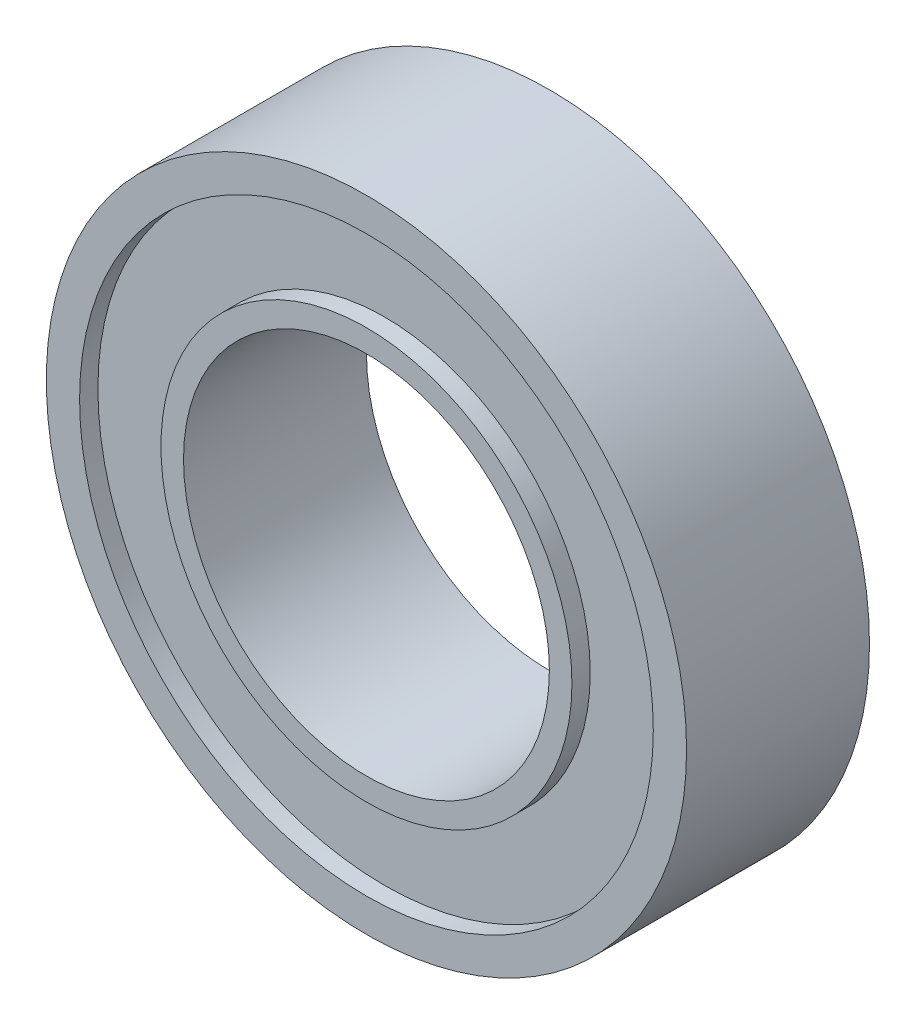
ISO-10303-21;
HEADER;
FILE_DESCRIPTION(('STEP AP214'),'2;1');
FILE_NAME('part.step','',(''),(''),'','','');
FILE_SCHEMA(('AUTOMOTIVE_DESIGN { 1 0 10303 214 1 1 1 1 }'));
ENDSEC;
DATA;
#1=APPLICATION_CONTEXT('core data for automotive mechanical design processes');
#2=APPLICATION_PROTOCOL_DEFINITION('international standard','automotive_design',2000,#1);
#3=PRODUCT_CONTEXT('',#1,'mechanical');
#4=PRODUCT('Part','Part','',(#3));
#5=PRODUCT_RELATED_PRODUCT_CATEGORY('part','',(#4));
#6=PRODUCT_DEFINITION_FORMATION('','',#4);
#7=PRODUCT_DEFINITION_CONTEXT('part definition',#1,'design');
#8=PRODUCT_DEFINITION('design','',#6,#7);
#9=PRODUCT_DEFINITION_SHAPE('','',#8);
#10=(LENGTH_UNIT() NAMED_UNIT(*) SI_UNIT(.MILLI.,.METRE.));
#11=(NAMED_UNIT(*) PLANE_ANGLE_UNIT() SI_UNIT($,.RADIAN.));
#12=(NAMED_UNIT(*) SI_UNIT($,.STERADIAN.) SOLID_ANGLE_UNIT());
#13=UNCERTAINTY_MEASURE_WITH_UNIT(LENGTH_MEASURE(1.E-05),#10,'distance_accuracy_value','');
#14=(GEOMETRIC_REPRESENTATION_CONTEXT(3) GLOBAL_UNCERTAINTY_ASSIGNED_CONTEXT((#13)) GLOBAL_UNIT_ASSIGNED_CONTEXT((#10,
#11,#12)) REPRESENTATION_CONTEXT('',''));
#15=CARTESIAN_POINT('',(0.,0.,0.));
#16=DIRECTION('',(0.,0.,1.));
#17=DIRECTION('',(1.,0.,0.));
#18=AXIS2_PLACEMENT_3D('',#15,#16,#17);
#19=CARTESIAN_POINT('',(0.,0.,0.3));
#20=DIRECTION('',(0.,0.,1.));
#21=DIRECTION('',(1.,0.,0.));
#22=AXIS2_PLACEMENT_3D('',#19,#20,#21);
#23=PLANE('',#22);
#24=CARTESIAN_POINT('',(0.,0.,0.3));
#25=DIRECTION('',(0.,0.,-1.));
#26=DIRECTION('',(1.,0.,0.));
#27=AXIS2_PLACEMENT_3D('',#24,#25,#26);
#28=CIRCLE('',#27,3.36995255977754);
#29=CARTESIAN_POINT('',(3.36995255977754,0.,0.3));
#30=VERTEX_POINT('',#29);
#31=EDGE_CURVE('E11',#30,#30,#28,.T.);
#32=ORIENTED_EDGE('',*,*,#31,.F.);
#33=EDGE_LOOP('',(#32));
#34=FACE_BOUND('',#33,.T.);
#35=CARTESIAN_POINT('',(0.,0.,0.3));
#36=DIRECTION('',(0.,0.,-1.));
#37=DIRECTION('',(1.,0.,0.));
#38=AXIS2_PLACEMENT_3D('',#35,#36,#37);
#39=CIRCLE('',#38,4.70453720566641);
#40=CARTESIAN_POINT('',(4.70453720566641,0.,0.3));
#41=VERTEX_POINT('',#40);
#42=EDGE_CURVE('E28',#41,#41,#39,.T.);
#43=ORIENTED_EDGE('',*,*,#42,.T.);
#44=EDGE_LOOP('',(#43));
#45=FACE_BOUND('',#44,.T.);
#46=ADVANCED_FACE('F17',(#34,#45),#23,.F.);
#47=CARTESIAN_POINT('',(0.,0.,0.3));
#48=DIRECTION('',(0.,0.,-1.));
#49=DIRECTION('',(-1.,0.,0.));
#50=AXIS2_PLACEMENT_3D('',#47,#48,#49);
#51=CYLINDRICAL_SURFACE('',#50,3.36995255977754);
#52=CARTESIAN_POINT('',(0.,0.,0.));
#53=DIRECTION('',(0.,0.,1.));
#54=DIRECTION('',(1.,0.,0.));
#55=AXIS2_PLACEMENT_3D('',#52,#53,#54);
#56=CIRCLE('',#55,3.36995255977754);
#57=CARTESIAN_POINT('',(3.36995255977754,0.,0.));
#58=VERTEX_POINT('',#57);
#59=EDGE_CURVE('E21',#58,#58,#56,.T.);
#60=ORIENTED_EDGE('',*,*,#59,.T.);
#61=EDGE_LOOP('',(#60));
#62=FACE_BOUND('',#61,.T.);
#63=ORIENTED_EDGE('',*,*,#31,.T.);
#64=EDGE_LOOP('',(#63));
#65=FACE_BOUND('',#64,.T.);
#66=ADVANCED_FACE('F137',(#62,#65),#51,.T.);
#67=CARTESIAN_POINT('',(0.,0.,0.3));
#68=DIRECTION('',(0.,0.,-1.));
#69=DIRECTION('',(-1.,0.,0.));
#70=AXIS2_PLACEMENT_3D('',#67,#68,#69);
#71=CYLINDRICAL_SURFACE('',#70,4.70453720566641);
#72=CARTESIAN_POINT('',(0.,0.,0.));
#73=DIRECTION('',(0.,0.,1.));
#74=DIRECTION('',(1.,0.,0.));
#75=AXIS2_PLACEMENT_3D('',#72,#73,#74);
#76=CIRCLE('',#75,4.70453720566641);
#77=CARTESIAN_POINT('',(4.70453720566641,0.,0.));
#78=VERTEX_POINT('',#77);
#79=EDGE_CURVE('E88',#78,#78,#76,.T.);
#80=ORIENTED_EDGE('',*,*,#79,.F.);
#81=EDGE_LOOP('',(#80));
#82=FACE_BOUND('',#81,.T.);
#83=ORIENTED_EDGE('',*,*,#42,.F.);
#84=EDGE_LOOP('',(#83));
#85=FACE_BOUND('',#84,.T.);
#86=ADVANCED_FACE('F19',(#82,#85),#71,.F.);
#87=CARTESIAN_POINT('',(0.,0.,2.7));
#88=DIRECTION('',(0.,0.,1.));
#89=DIRECTION('',(1.,0.,0.));
#90=AXIS2_PLACEMENT_3D('',#87,#88,#89);
#91=PLANE('',#90);
#92=CARTESIAN_POINT('',(0.,0.,2.7));
#93=DIRECTION('',(0.,0.,-1.));
#94=DIRECTION('',(1.,0.,0.));
#95=AXIS2_PLACEMENT_3D('',#92,#93,#94);
#96=CIRCLE('',#95,3.36995255977754);
#97=CARTESIAN_POINT('',(3.36995255977754,0.,2.7));
#98=VERTEX_POINT('',#97);
#99=EDGE_CURVE('E78',#98,#98,#96,.T.);
#100=ORIENTED_EDGE('',*,*,#99,.T.);
#101=EDGE_LOOP('',(#100));
#102=FACE_BOUND('',#101,.T.);
#103=CARTESIAN_POINT('',(0.,0.,2.7));
#104=DIRECTION('',(0.,0.,-1.));
#105=DIRECTION('',(1.,0.,0.));
#106=AXIS2_PLACEMENT_3D('',#103,#104,#105);
#107=CIRCLE('',#106,4.70453720566641);
#108=CARTESIAN_POINT('',(4.70453720566641,0.,2.7));
#109=VERTEX_POINT('',#108);
#110=EDGE_CURVE('E84',#109,#109,#107,.T.);
#111=ORIENTED_EDGE('',*,*,#110,.F.);
#112=EDGE_LOOP('',(#111));
#113=FACE_BOUND('',#112,.T.);
#114=ADVANCED_FACE('F136',(#102,#113),#91,.T.);
#115=CARTESIAN_POINT('',(0.,0.,2.7));
#116=DIRECTION('',(0.,0.,1.));
#117=DIRECTION('',(1.,0.,0.));
#118=AXIS2_PLACEMENT_3D('',#115,#116,#117);
#119=CYLINDRICAL_SURFACE('',#118,3.36995255977754);
#120=CARTESIAN_POINT('',(0.,0.,3.));
#121=DIRECTION('',(0.,0.,1.));
#122=DIRECTION('',(1.,0.,0.));
#123=AXIS2_PLACEMENT_3D('',#120,#121,#122);
#124=CIRCLE('',#123,3.36995255977754);
#125=CARTESIAN_POINT('',(3.36995255977754,0.,3.));
#126=VERTEX_POINT('',#125);
#127=EDGE_CURVE('E104',#126,#126,#124,.T.);
#128=ORIENTED_EDGE('',*,*,#127,.F.);
#129=EDGE_LOOP('',(#128));
#130=FACE_BOUND('',#129,.T.);
#131=ORIENTED_EDGE('',*,*,#99,.F.);
#132=EDGE_LOOP('',(#131));
#133=FACE_BOUND('',#132,.T.);
#134=ADVANCED_FACE('F145',(#130,#133),#119,.T.);
#135=CARTESIAN_POINT('',(0.,0.,2.7));
#136=DIRECTION('',(0.,0.,1.));
#137=DIRECTION('',(1.,0.,0.));
#138=AXIS2_PLACEMENT_3D('',#135,#136,#137);
#139=CYLINDRICAL_SURFACE('',#138,4.70453720566641);
#140=CARTESIAN_POINT('',(0.,0.,3.));
#141=DIRECTION('',(0.,0.,1.));
#142=DIRECTION('',(1.,0.,0.));
#143=AXIS2_PLACEMENT_3D('',#140,#141,#142);
#144=CIRCLE('',#143,4.70453720566641);
#145=CARTESIAN_POINT('',(4.70453720566641,0.,3.));
#146=VERTEX_POINT('',#145);
#147=EDGE_CURVE('E96',#146,#146,#144,.T.);
#148=ORIENTED_EDGE('',*,*,#147,.T.);
#149=EDGE_LOOP('',(#148));
#150=FACE_BOUND('',#149,.T.);
#151=ORIENTED_EDGE('',*,*,#110,.T.);
#152=EDGE_LOOP('',(#151));
#153=FACE_BOUND('',#152,.T.);
#154=ADVANCED_FACE('F85',(#150,#153),#139,.F.);
#155=CARTESIAN_POINT('',(0.,0.,0.));
#156=DIRECTION('',(0.,0.,1.));
#157=DIRECTION('',(1.,0.,0.));
#158=AXIS2_PLACEMENT_3D('',#155,#156,#157);
#159=PLANE('',#158);
#160=CARTESIAN_POINT('',(0.,0.,0.));
#161=DIRECTION('',(0.,0.,1.));
#162=DIRECTION('',(1.,0.,0.));
#163=AXIS2_PLACEMENT_3D('',#160,#161,#162);
#164=CIRCLE('',#163,5.25);
#165=CARTESIAN_POINT('',(5.25,0.,0.));
#166=VERTEX_POINT('',#165);
#167=EDGE_CURVE('E101',#166,#166,#164,.T.);
#168=ORIENTED_EDGE('',*,*,#167,.F.);
#169=EDGE_LOOP('',(#168));
#170=FACE_BOUND('',#169,.T.);
#171=ORIENTED_EDGE('',*,*,#79,.T.);
#172=EDGE_LOOP('',(#171));
#173=FACE_BOUND('',#172,.T.);
#174=ADVANCED_FACE('F162',(#170,#173),#159,.F.);
#175=CARTESIAN_POINT('',(0.,0.,3.));
#176=DIRECTION('',(0.,0.,1.));
#177=DIRECTION('',(1.,0.,0.));
#178=AXIS2_PLACEMENT_3D('',#175,#176,#177);
#179=PLANE('',#178);
#180=CARTESIAN_POINT('',(0.,0.,3.));
#181=DIRECTION('',(0.,0.,1.));
#182=DIRECTION('',(1.,0.,0.));
#183=AXIS2_PLACEMENT_3D('',#180,#181,#182);
#184=CIRCLE('',#183,5.25);
#185=CARTESIAN_POINT('',(5.25,0.,3.));
#186=VERTEX_POINT('',#185);
#187=EDGE_CURVE('E111',#186,#186,#184,.T.);
#188=ORIENTED_EDGE('',*,*,#187,.T.);
#189=EDGE_LOOP('',(#188));
#190=FACE_BOUND('',#189,.T.);
#191=ORIENTED_EDGE('',*,*,#147,.F.);
#192=EDGE_LOOP('',(#191));
#193=FACE_BOUND('',#192,.T.);
#194=ADVANCED_FACE('F165',(#190,#193),#179,.T.);
#195=CARTESIAN_POINT('',(0.,0.,3.));
#196=DIRECTION('',(0.,0.,-1.));
#197=DIRECTION('',(-1.,0.,0.));
#198=AXIS2_PLACEMENT_3D('',#195,#196,#197);
#199=CYLINDRICAL_SURFACE('',#198,3.);
#200=CARTESIAN_POINT('',(0.,0.,0.));
#201=DIRECTION('',(0.,0.,1.));
#202=DIRECTION('',(1.,0.,0.));
#203=AXIS2_PLACEMENT_3D('',#200,#201,#202);
#204=CIRCLE('',#203,3.);
#205=CARTESIAN_POINT('',(3.,0.,0.));
#206=VERTEX_POINT('',#205);
#207=EDGE_CURVE('E113',#206,#206,#204,.T.);
#208=ORIENTED_EDGE('',*,*,#207,.F.);
#209=EDGE_LOOP('',(#208));
#210=FACE_BOUND('',#209,.T.);
#211=CARTESIAN_POINT('',(0.,0.,3.));
#212=DIRECTION('',(0.,0.,1.));
#213=DIRECTION('',(1.,0.,0.));
#214=AXIS2_PLACEMENT_3D('',#211,#212,#213);
#215=CIRCLE('',#214,3.);
#216=CARTESIAN_POINT('',(3.,0.,3.));
#217=VERTEX_POINT('',#216);
#218=EDGE_CURVE('E102',#217,#217,#215,.T.);
#219=ORIENTED_EDGE('',*,*,#218,.T.);
#220=EDGE_LOOP('',(#219));
#221=FACE_BOUND('',#220,.T.);
#222=ADVANCED_FACE('F160',(#210,#221),#199,.F.);
#223=CARTESIAN_POINT('',(0.,0.,3.));
#224=DIRECTION('',(0.,0.,-1.));
#225=DIRECTION('',(-1.,0.,0.));
#226=AXIS2_PLACEMENT_3D('',#223,#224,#225);
#227=CYLINDRICAL_SURFACE('',#226,5.25);
#228=ORIENTED_EDGE('',*,*,#167,.T.);
#229=EDGE_LOOP('',(#228));
#230=FACE_BOUND('',#229,.T.);
#231=ORIENTED_EDGE('',*,*,#187,.F.);
#232=EDGE_LOOP('',(#231));
#233=FACE_BOUND('',#232,.T.);
#234=ADVANCED_FACE('F156',(#230,#233),#227,.T.);
#235=CARTESIAN_POINT('',(0.,0.,3.));
#236=DIRECTION('',(0.,0.,1.));
#237=DIRECTION('',(1.,0.,0.));
#238=AXIS2_PLACEMENT_3D('',#235,#236,#237);
#239=PLANE('',#238);
#240=ORIENTED_EDGE('',*,*,#127,.T.);
#241=EDGE_LOOP('',(#240));
#242=FACE_BOUND('',#241,.T.);
#243=ORIENTED_EDGE('',*,*,#218,.F.);
#244=EDGE_LOOP('',(#243));
#245=FACE_BOUND('',#244,.T.);
#246=ADVANCED_FACE('F159',(#242,#245),#239,.T.);
#247=CARTESIAN_POINT('',(0.,0.,0.));
#248=DIRECTION('',(0.,0.,1.));
#249=DIRECTION('',(1.,0.,0.));
#250=AXIS2_PLACEMENT_3D('',#247,#248,#249);
#251=PLANE('',#250);
#252=ORIENTED_EDGE('',*,*,#59,.F.);
#253=EDGE_LOOP('',(#252));
#254=FACE_BOUND('',#253,.T.);
#255=ORIENTED_EDGE('',*,*,#207,.T.);
#256=EDGE_LOOP('',(#255));
#257=FACE_BOUND('',#256,.T.);
#258=ADVANCED_FACE('F176',(#254,#257),#251,.F.);
#259=CLOSED_SHELL('',(#46,#66,#86,#114,#134,#154,#174,#194,#222,#234,#246,#258));
#260=MANIFOLD_SOLID_BREP('B1',#259);
#261=ADVANCED_BREP_SHAPE_REPRESENTATION('',(#18,#260),#14);
#262=SHAPE_DEFINITION_REPRESENTATION(#9,#261);
ENDSEC;
END-ISO-10303-21;
